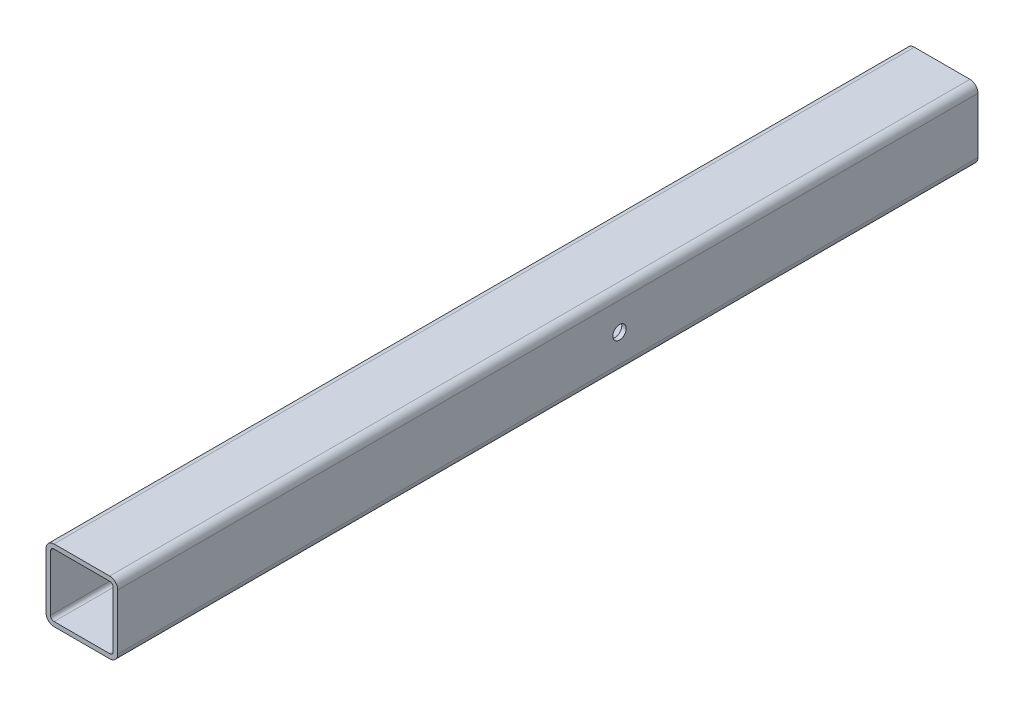
ISO-10303-21;
HEADER;
FILE_DESCRIPTION(('STEP AP214'),'2;1');
FILE_NAME('part.step','',(''),(''),'','','');
FILE_SCHEMA(('AUTOMOTIVE_DESIGN { 1 0 10303 214 1 1 1 1 }'));
ENDSEC;
DATA;
#1=APPLICATION_CONTEXT('core data for automotive mechanical design processes');
#2=APPLICATION_PROTOCOL_DEFINITION('international standard','automotive_design',2000,#1);
#3=PRODUCT_CONTEXT('',#1,'mechanical');
#4=PRODUCT('Part','Part','',(#3));
#5=PRODUCT_RELATED_PRODUCT_CATEGORY('part','',(#4));
#6=PRODUCT_DEFINITION_FORMATION('','',#4);
#7=PRODUCT_DEFINITION_CONTEXT('part definition',#1,'design');
#8=PRODUCT_DEFINITION('design','',#6,#7);
#9=PRODUCT_DEFINITION_SHAPE('','',#8);
#10=(LENGTH_UNIT() NAMED_UNIT(*) SI_UNIT(.MILLI.,.METRE.));
#11=(NAMED_UNIT(*) PLANE_ANGLE_UNIT() SI_UNIT($,.RADIAN.));
#12=(NAMED_UNIT(*) SI_UNIT($,.STERADIAN.) SOLID_ANGLE_UNIT());
#13=UNCERTAINTY_MEASURE_WITH_UNIT(LENGTH_MEASURE(1.E-05),#10,'distance_accuracy_value','');
#14=(GEOMETRIC_REPRESENTATION_CONTEXT(3) GLOBAL_UNCERTAINTY_ASSIGNED_CONTEXT((#13)) GLOBAL_UNIT_ASSIGNED_CONTEXT((#10,
#11,#12)) REPRESENTATION_CONTEXT('',''));
#15=CARTESIAN_POINT('',(0.,0.,0.));
#16=DIRECTION('',(0.,0.,1.));
#17=DIRECTION('',(1.,0.,0.));
#18=AXIS2_PLACEMENT_3D('',#15,#16,#17);
#19=CARTESIAN_POINT('',(-19.6849999999999,19.6849999999998,304.8));
#20=DIRECTION('',(0.,0.,-1.));
#21=DIRECTION('',(-1.,0.,0.));
#22=AXIS2_PLACEMENT_3D('',#19,#20,#21);
#23=PLANE('',#22);
#24=CARTESIAN_POINT('',(-19.6849999999999,19.6849999999998,304.8));
#25=DIRECTION('',(0.,0.,1.));
#26=DIRECTION('',(-1.,0.,0.));
#27=AXIS2_PLACEMENT_3D('',#24,#25,#26);
#28=CIRCLE('',#27,5.715);
#29=CARTESIAN_POINT('',(-19.685,25.3999999999998,304.8));
#30=VERTEX_POINT('',#29);
#31=CARTESIAN_POINT('',(-25.3999999999999,19.6850000000001,304.8));
#32=VERTEX_POINT('',#31);
#33=EDGE_CURVE('E215',#30,#32,#28,.T.);
#34=ORIENTED_EDGE('',*,*,#33,.T.);
#35=DIRECTION('',(0.,-1.,0.));
#36=VECTOR('',#35,1.);
#37=CARTESIAN_POINT('',(-25.3999999999999,-19.6850000000001,304.8));
#38=LINE('',#37,#36);
#39=CARTESIAN_POINT('',(-25.3999999999999,-19.6850000000001,304.8));
#40=VERTEX_POINT('',#39);
#41=EDGE_CURVE('E218',#32,#40,#38,.T.);
#42=ORIENTED_EDGE('',*,*,#41,.T.);
#43=CARTESIAN_POINT('',(-19.6849999999999,-19.6850000000002,304.8));
#44=DIRECTION('',(0.,0.,1.));
#45=DIRECTION('',(-1.,0.,0.));
#46=AXIS2_PLACEMENT_3D('',#43,#44,#45);
#47=CIRCLE('',#46,5.715);
#48=CARTESIAN_POINT('',(-19.685,-25.4000000000002,304.8));
#49=VERTEX_POINT('',#48);
#50=EDGE_CURVE('E221',#40,#49,#47,.T.);
#51=ORIENTED_EDGE('',*,*,#50,.T.);
#52=DIRECTION('',(1.,0.,0.));
#53=VECTOR('',#52,1.);
#54=CARTESIAN_POINT('',(-19.685,-25.4000000000002,304.8));
#55=LINE('',#54,#53);
#56=CARTESIAN_POINT('',(19.685,-25.4,304.8));
#57=VERTEX_POINT('',#56);
#58=EDGE_CURVE('E223',#49,#57,#55,.T.);
#59=ORIENTED_EDGE('',*,*,#58,.T.);
#60=CARTESIAN_POINT('',(19.6850000000001,-19.6850000000001,304.8));
#61=DIRECTION('',(0.,0.,1.));
#62=DIRECTION('',(1.,0.,0.));
#63=AXIS2_PLACEMENT_3D('',#60,#61,#62);
#64=CIRCLE('',#63,5.715);
#65=CARTESIAN_POINT('',(25.4000000000001,-19.685,304.8));
#66=VERTEX_POINT('',#65);
#67=EDGE_CURVE('E225',#57,#66,#64,.T.);
#68=ORIENTED_EDGE('',*,*,#67,.T.);
#69=DIRECTION('',(0.,1.,0.));
#70=VECTOR('',#69,1.);
#71=CARTESIAN_POINT('',(25.4000000000001,-19.685,304.8));
#72=LINE('',#71,#70);
#73=CARTESIAN_POINT('',(25.4000000000001,19.6850000000001,304.8));
#74=VERTEX_POINT('',#73);
#75=EDGE_CURVE('E227',#66,#74,#72,.T.);
#76=ORIENTED_EDGE('',*,*,#75,.T.);
#77=CARTESIAN_POINT('',(19.6850000000001,19.685,304.8));
#78=DIRECTION('',(0.,0.,1.));
#79=DIRECTION('',(-1.,0.,0.));
#80=AXIS2_PLACEMENT_3D('',#77,#78,#79);
#81=CIRCLE('',#80,5.715);
#82=CARTESIAN_POINT('',(19.685,25.4,304.8));
#83=VERTEX_POINT('',#82);
#84=EDGE_CURVE('E229',#74,#83,#81,.T.);
#85=ORIENTED_EDGE('',*,*,#84,.T.);
#86=DIRECTION('',(-1.,0.,0.));
#87=VECTOR('',#86,1.);
#88=CARTESIAN_POINT('',(-19.685,25.3999999999998,304.8));
#89=LINE('',#88,#87);
#90=EDGE_CURVE('E231',#83,#30,#89,.T.);
#91=ORIENTED_EDGE('',*,*,#90,.T.);
#92=EDGE_LOOP('',(#34,#42,#51,#59,#68,#76,#85,#91));
#93=FACE_BOUND('',#92,.T.);
#94=CARTESIAN_POINT('',(-19.6849999999999,-19.6850000000002,304.8));
#95=DIRECTION('',(0.,0.,1.));
#96=DIRECTION('',(-1.,0.,0.));
#97=AXIS2_PLACEMENT_3D('',#94,#95,#96);
#98=CIRCLE('',#97,2.54);
#99=CARTESIAN_POINT('',(-22.2249999999999,-19.685,304.8));
#100=VERTEX_POINT('',#99);
#101=CARTESIAN_POINT('',(-19.685,-22.2250000000002,304.8));
#102=VERTEX_POINT('',#101);
#103=EDGE_CURVE('E148',#100,#102,#98,.T.);
#104=ORIENTED_EDGE('',*,*,#103,.F.);
#105=DIRECTION('',(0.,-1.,0.));
#106=VECTOR('',#105,1.);
#107=CARTESIAN_POINT('',(-22.2249999999999,-19.685,304.8));
#108=LINE('',#107,#106);
#109=CARTESIAN_POINT('',(-22.2249999999999,19.6850000000001,304.8));
#110=VERTEX_POINT('',#109);
#111=EDGE_CURVE('E182',#110,#100,#108,.T.);
#112=ORIENTED_EDGE('',*,*,#111,.F.);
#113=CARTESIAN_POINT('',(-19.6849999999999,19.6849999999998,304.8));
#114=DIRECTION('',(0.,0.,1.));
#115=DIRECTION('',(-1.,0.,0.));
#116=AXIS2_PLACEMENT_3D('',#113,#114,#115);
#117=CIRCLE('',#116,2.54);
#118=CARTESIAN_POINT('',(-19.685,22.2249999999998,304.8));
#119=VERTEX_POINT('',#118);
#120=EDGE_CURVE('E180',#119,#110,#117,.T.);
#121=ORIENTED_EDGE('',*,*,#120,.F.);
#122=DIRECTION('',(-1.,0.,0.));
#123=VECTOR('',#122,1.);
#124=CARTESIAN_POINT('',(-19.685,22.2249999999998,304.8));
#125=LINE('',#124,#123);
#126=CARTESIAN_POINT('',(19.685,22.2249999999999,304.8));
#127=VERTEX_POINT('',#126);
#128=EDGE_CURVE('E178',#127,#119,#125,.T.);
#129=ORIENTED_EDGE('',*,*,#128,.F.);
#130=CARTESIAN_POINT('',(19.6850000000001,19.685,304.8));
#131=DIRECTION('',(0.,0.,1.));
#132=DIRECTION('',(-1.,0.,0.));
#133=AXIS2_PLACEMENT_3D('',#130,#131,#132);
#134=CIRCLE('',#133,2.54);
#135=CARTESIAN_POINT('',(22.2250000000001,19.685,304.8));
#136=VERTEX_POINT('',#135);
#137=EDGE_CURVE('E176',#136,#127,#134,.T.);
#138=ORIENTED_EDGE('',*,*,#137,.F.);
#139=DIRECTION('',(0.,1.,0.));
#140=VECTOR('',#139,1.);
#141=CARTESIAN_POINT('',(22.2250000000001,-19.685,304.8));
#142=LINE('',#141,#140);
#143=CARTESIAN_POINT('',(22.2250000000001,-19.685,304.8));
#144=VERTEX_POINT('',#143);
#145=EDGE_CURVE('E171',#144,#136,#142,.T.);
#146=ORIENTED_EDGE('',*,*,#145,.F.);
#147=CARTESIAN_POINT('',(19.6850000000001,-19.6850000000001,304.8));
#148=DIRECTION('',(0.,0.,1.));
#149=DIRECTION('',(1.,0.,0.));
#150=AXIS2_PLACEMENT_3D('',#147,#148,#149);
#151=CIRCLE('',#150,2.54);
#152=CARTESIAN_POINT('',(19.685,-22.2250000000001,304.8));
#153=VERTEX_POINT('',#152);
#154=EDGE_CURVE('E169',#153,#144,#151,.T.);
#155=ORIENTED_EDGE('',*,*,#154,.F.);
#156=DIRECTION('',(1.,0.,0.));
#157=VECTOR('',#156,1.);
#158=CARTESIAN_POINT('',(-19.685,-22.2250000000002,304.8));
#159=LINE('',#158,#157);
#160=EDGE_CURVE('E156',#102,#153,#159,.T.);
#161=ORIENTED_EDGE('',*,*,#160,.F.);
#162=EDGE_LOOP('',(#104,#112,#121,#129,#138,#146,#155,#161));
#163=FACE_BOUND('',#162,.T.);
#164=ADVANCED_FACE('F34',(#93,#163),#23,.F.);
#165=CARTESIAN_POINT('',(-19.685,19.685,-304.8));
#166=DIRECTION('',(0.,0.,-1.));
#167=DIRECTION('',(-1.,0.,0.));
#168=AXIS2_PLACEMENT_3D('',#165,#166,#167);
#169=PLANE('',#168);
#170=CARTESIAN_POINT('',(-19.685,19.685,-304.8));
#171=DIRECTION('',(0.,0.,1.));
#172=DIRECTION('',(-1.,0.,0.));
#173=AXIS2_PLACEMENT_3D('',#170,#171,#172);
#174=CIRCLE('',#173,5.715);
#175=CARTESIAN_POINT('',(-19.685,25.4,-304.8));
#176=VERTEX_POINT('',#175);
#177=CARTESIAN_POINT('',(-25.4,19.6849999999998,-304.8));
#178=VERTEX_POINT('',#177);
#179=EDGE_CURVE('E164',#176,#178,#174,.T.);
#180=ORIENTED_EDGE('',*,*,#179,.F.);
#181=DIRECTION('',(-1.,0.,0.));
#182=VECTOR('',#181,1.);
#183=CARTESIAN_POINT('',(-19.685,25.4,-304.8));
#184=LINE('',#183,#182);
#185=CARTESIAN_POINT('',(19.685,25.3999999999999,-304.8));
#186=VERTEX_POINT('',#185);
#187=EDGE_CURVE('E219',#186,#176,#184,.T.);
#188=ORIENTED_EDGE('',*,*,#187,.F.);
#189=CARTESIAN_POINT('',(19.685,19.6849999999998,-304.8));
#190=DIRECTION('',(0.,0.,1.));
#191=DIRECTION('',(-1.,0.,0.));
#192=AXIS2_PLACEMENT_3D('',#189,#190,#191);
#193=CIRCLE('',#192,5.715);
#194=CARTESIAN_POINT('',(25.4,19.6849999999998,-304.8));
#195=VERTEX_POINT('',#194);
#196=EDGE_CURVE('E246',#195,#186,#193,.T.);
#197=ORIENTED_EDGE('',*,*,#196,.F.);
#198=DIRECTION('',(0.,1.,0.));
#199=VECTOR('',#198,1.);
#200=CARTESIAN_POINT('',(25.4,-19.6850000000001,-304.8));
#201=LINE('',#200,#199);
#202=CARTESIAN_POINT('',(25.4,-19.6850000000001,-304.8));
#203=VERTEX_POINT('',#202);
#204=EDGE_CURVE('E244',#203,#195,#201,.T.);
#205=ORIENTED_EDGE('',*,*,#204,.F.);
#206=CARTESIAN_POINT('',(19.685,-19.6850000000002,-304.8));
#207=DIRECTION('',(0.,0.,1.));
#208=DIRECTION('',(1.,0.,0.));
#209=AXIS2_PLACEMENT_3D('',#206,#207,#208);
#210=CIRCLE('',#209,5.715);
#211=CARTESIAN_POINT('',(19.685,-25.4000000000002,-304.800000000001));
#212=VERTEX_POINT('',#211);
#213=EDGE_CURVE('E242',#212,#203,#210,.T.);
#214=ORIENTED_EDGE('',*,*,#213,.F.);
#215=DIRECTION('',(1.,0.,0.));
#216=VECTOR('',#215,1.);
#217=CARTESIAN_POINT('',(-19.685,-25.4,-304.800000000001));
#218=LINE('',#217,#216);
#219=CARTESIAN_POINT('',(-19.685,-25.4,-304.800000000001));
#220=VERTEX_POINT('',#219);
#221=EDGE_CURVE('E240',#220,#212,#218,.T.);
#222=ORIENTED_EDGE('',*,*,#221,.F.);
#223=CARTESIAN_POINT('',(-19.685,-19.6850000000001,-304.8));
#224=DIRECTION('',(0.,0.,1.));
#225=DIRECTION('',(-1.,0.,0.));
#226=AXIS2_PLACEMENT_3D('',#223,#224,#225);
#227=CIRCLE('',#226,5.715);
#228=CARTESIAN_POINT('',(-25.4,-19.6850000000002,-304.8));
#229=VERTEX_POINT('',#228);
#230=EDGE_CURVE('E238',#229,#220,#227,.T.);
#231=ORIENTED_EDGE('',*,*,#230,.F.);
#232=DIRECTION('',(0.,-1.,0.));
#233=VECTOR('',#232,1.);
#234=CARTESIAN_POINT('',(-25.4,-19.6850000000002,-304.8));
#235=LINE('',#234,#233);
#236=EDGE_CURVE('E236',#178,#229,#235,.T.);
#237=ORIENTED_EDGE('',*,*,#236,.F.);
#238=EDGE_LOOP('',(#180,#188,#197,#205,#214,#222,#231,#237));
#239=FACE_BOUND('',#238,.T.);
#240=DIRECTION('',(0.,-1.,0.));
#241=VECTOR('',#240,1.);
#242=CARTESIAN_POINT('',(-22.225,-19.6850000000002,-304.8));
#243=LINE('',#242,#241);
#244=CARTESIAN_POINT('',(-22.225,19.685,-304.8));
#245=VERTEX_POINT('',#244);
#246=CARTESIAN_POINT('',(-22.225,-19.6850000000002,-304.8));
#247=VERTEX_POINT('',#246);
#248=EDGE_CURVE('E157',#245,#247,#243,.T.);
#249=ORIENTED_EDGE('',*,*,#248,.T.);
#250=CARTESIAN_POINT('',(-19.685,-19.6850000000001,-304.8));
#251=DIRECTION('',(0.,0.,1.));
#252=DIRECTION('',(-1.,0.,0.));
#253=AXIS2_PLACEMENT_3D('',#250,#251,#252);
#254=CIRCLE('',#253,2.54);
#255=CARTESIAN_POINT('',(-19.685,-22.2250000000001,-304.8));
#256=VERTEX_POINT('',#255);
#257=EDGE_CURVE('E58',#247,#256,#254,.T.);
#258=ORIENTED_EDGE('',*,*,#257,.T.);
#259=DIRECTION('',(1.,0.,0.));
#260=VECTOR('',#259,1.);
#261=CARTESIAN_POINT('',(-19.685,-22.2250000000001,-304.8));
#262=LINE('',#261,#260);
#263=CARTESIAN_POINT('',(19.685,-22.2250000000002,-304.8));
#264=VERTEX_POINT('',#263);
#265=EDGE_CURVE('E163',#256,#264,#262,.T.);
#266=ORIENTED_EDGE('',*,*,#265,.T.);
#267=CARTESIAN_POINT('',(19.685,-19.6850000000002,-304.8));
#268=DIRECTION('',(0.,0.,1.));
#269=DIRECTION('',(1.,0.,0.));
#270=AXIS2_PLACEMENT_3D('',#267,#268,#269);
#271=CIRCLE('',#270,2.54);
#272=CARTESIAN_POINT('',(22.225,-19.6850000000002,-304.8));
#273=VERTEX_POINT('',#272);
#274=EDGE_CURVE('E187',#264,#273,#271,.T.);
#275=ORIENTED_EDGE('',*,*,#274,.T.);
#276=DIRECTION('',(0.,1.,0.));
#277=VECTOR('',#276,1.);
#278=CARTESIAN_POINT('',(22.225,-19.6850000000002,-304.8));
#279=LINE('',#278,#277);
#280=CARTESIAN_POINT('',(22.225,19.6849999999998,-304.8));
#281=VERTEX_POINT('',#280);
#282=EDGE_CURVE('E190',#273,#281,#279,.T.);
#283=ORIENTED_EDGE('',*,*,#282,.T.);
#284=CARTESIAN_POINT('',(19.685,19.6849999999998,-304.8));
#285=DIRECTION('',(0.,0.,1.));
#286=DIRECTION('',(-1.,0.,0.));
#287=AXIS2_PLACEMENT_3D('',#284,#285,#286);
#288=CIRCLE('',#287,2.54);
#289=CARTESIAN_POINT('',(19.685,22.2249999999998,-304.8));
#290=VERTEX_POINT('',#289);
#291=EDGE_CURVE('E193',#281,#290,#288,.T.);
#292=ORIENTED_EDGE('',*,*,#291,.T.);
#293=DIRECTION('',(-1.,0.,0.));
#294=VECTOR('',#293,1.);
#295=CARTESIAN_POINT('',(-19.685,22.2249999999999,-304.8));
#296=LINE('',#295,#294);
#297=CARTESIAN_POINT('',(-19.685,22.2249999999999,-304.8));
#298=VERTEX_POINT('',#297);
#299=EDGE_CURVE('E196',#290,#298,#296,.T.);
#300=ORIENTED_EDGE('',*,*,#299,.T.);
#301=CARTESIAN_POINT('',(-19.685,19.685,-304.8));
#302=DIRECTION('',(0.,0.,1.));
#303=DIRECTION('',(-1.,0.,0.));
#304=AXIS2_PLACEMENT_3D('',#301,#302,#303);
#305=CIRCLE('',#304,2.54);
#306=EDGE_CURVE('E199',#298,#245,#305,.T.);
#307=ORIENTED_EDGE('',*,*,#306,.T.);
#308=EDGE_LOOP('',(#249,#258,#266,#275,#283,#292,#300,#307));
#309=FACE_BOUND('',#308,.T.);
#310=ADVANCED_FACE('F277',(#239,#309),#169,.T.);
#311=CARTESIAN_POINT('',(-19.6849999999999,19.6849999999998,304.8));
#312=DIRECTION('',(0.,0.,-1.));
#313=DIRECTION('',(-1.,0.,0.));
#314=AXIS2_PLACEMENT_3D('',#311,#312,#313);
#315=CYLINDRICAL_SURFACE('',#314,5.715);
#316=ORIENTED_EDGE('',*,*,#179,.T.);
#317=DIRECTION('',(0.,0.,-1.));
#318=VECTOR('',#317,1.);
#319=CARTESIAN_POINT('',(-25.3999999999999,19.6850000000001,304.8));
#320=LINE('',#319,#318);
#321=EDGE_CURVE('E11',#32,#178,#320,.T.);
#322=ORIENTED_EDGE('',*,*,#321,.F.);
#323=ORIENTED_EDGE('',*,*,#33,.F.);
#324=DIRECTION('',(0.,0.,-1.));
#325=VECTOR('',#324,1.);
#326=CARTESIAN_POINT('',(-19.685,25.3999999999998,304.8));
#327=LINE('',#326,#325);
#328=EDGE_CURVE('E233',#30,#176,#327,.T.);
#329=ORIENTED_EDGE('',*,*,#328,.T.);
#330=EDGE_LOOP('',(#316,#322,#323,#329));
#331=FACE_BOUND('',#330,.T.);
#332=ADVANCED_FACE('F36',(#331),#315,.T.);
#333=CARTESIAN_POINT('',(-25.3999999999999,-19.6850000000001,304.8));
#334=DIRECTION('',(1.,0.,0.));
#335=DIRECTION('',(0.,1.,0.));
#336=AXIS2_PLACEMENT_3D('',#333,#334,#335);
#337=PLANE('',#336);
#338=CARTESIAN_POINT('',(-25.3999999999999,-2.22044604925031E-13,-50.8));
#339=DIRECTION('',(1.,0.,0.));
#340=DIRECTION('',(0.,1.,0.));
#341=AXIS2_PLACEMENT_3D('',#338,#339,#340);
#342=CIRCLE('',#341,4.7625);
#343=CARTESIAN_POINT('',(-25.4,4.76250000000001,-50.8));
#344=VERTEX_POINT('',#343);
#345=EDGE_CURVE('E185',#344,#344,#342,.T.);
#346=ORIENTED_EDGE('',*,*,#345,.T.);
#347=EDGE_LOOP('',(#346));
#348=FACE_BOUND('',#347,.T.);
#349=ORIENTED_EDGE('',*,*,#236,.T.);
#350=DIRECTION('',(0.,0.,-1.));
#351=VECTOR('',#350,1.);
#352=CARTESIAN_POINT('',(-25.3999999999999,-19.6850000000001,304.8));
#353=LINE('',#352,#351);
#354=EDGE_CURVE('E43',#40,#229,#353,.T.);
#355=ORIENTED_EDGE('',*,*,#354,.F.);
#356=ORIENTED_EDGE('',*,*,#41,.F.);
#357=ORIENTED_EDGE('',*,*,#321,.T.);
#358=EDGE_LOOP('',(#349,#355,#356,#357));
#359=FACE_BOUND('',#358,.T.);
#360=ADVANCED_FACE('F294',(#348,#359),#337,.F.);
#361=CARTESIAN_POINT('',(-19.6849999999999,-19.6850000000002,304.8));
#362=DIRECTION('',(0.,0.,-1.));
#363=DIRECTION('',(-1.,0.,0.));
#364=AXIS2_PLACEMENT_3D('',#361,#362,#363);
#365=CYLINDRICAL_SURFACE('',#364,5.715);
#366=ORIENTED_EDGE('',*,*,#230,.T.);
#367=DIRECTION('',(0.,0.,-1.));
#368=VECTOR('',#367,1.);
#369=CARTESIAN_POINT('',(-19.685,-25.4000000000002,304.8));
#370=LINE('',#369,#368);
#371=EDGE_CURVE('E263',#49,#220,#370,.T.);
#372=ORIENTED_EDGE('',*,*,#371,.F.);
#373=ORIENTED_EDGE('',*,*,#50,.F.);
#374=ORIENTED_EDGE('',*,*,#354,.T.);
#375=EDGE_LOOP('',(#366,#372,#373,#374));
#376=FACE_BOUND('',#375,.T.);
#377=ADVANCED_FACE('F271',(#376),#365,.T.);
#378=CARTESIAN_POINT('',(-19.685,-25.4000000000002,304.8));
#379=DIRECTION('',(0.,1.,0.));
#380=DIRECTION('',(-1.,0.,0.));
#381=AXIS2_PLACEMENT_3D('',#378,#379,#380);
#382=PLANE('',#381);
#383=ORIENTED_EDGE('',*,*,#221,.T.);
#384=DIRECTION('',(0.,0.,-1.));
#385=VECTOR('',#384,1.);
#386=CARTESIAN_POINT('',(19.685,-25.4,304.8));
#387=LINE('',#386,#385);
#388=EDGE_CURVE('E260',#57,#212,#387,.T.);
#389=ORIENTED_EDGE('',*,*,#388,.F.);
#390=ORIENTED_EDGE('',*,*,#58,.F.);
#391=ORIENTED_EDGE('',*,*,#371,.T.);
#392=EDGE_LOOP('',(#383,#389,#390,#391));
#393=FACE_BOUND('',#392,.T.);
#394=ADVANCED_FACE('F283',(#393),#382,.F.);
#395=CARTESIAN_POINT('',(19.6850000000001,-19.6850000000001,304.8));
#396=DIRECTION('',(0.,0.,-1.));
#397=DIRECTION('',(-1.,0.,0.));
#398=AXIS2_PLACEMENT_3D('',#395,#396,#397);
#399=CYLINDRICAL_SURFACE('',#398,5.715);
#400=ORIENTED_EDGE('',*,*,#213,.T.);
#401=DIRECTION('',(0.,0.,-1.));
#402=VECTOR('',#401,1.);
#403=CARTESIAN_POINT('',(25.4000000000001,-19.685,304.8));
#404=LINE('',#403,#402);
#405=EDGE_CURVE('E257',#66,#203,#404,.T.);
#406=ORIENTED_EDGE('',*,*,#405,.F.);
#407=ORIENTED_EDGE('',*,*,#67,.F.);
#408=ORIENTED_EDGE('',*,*,#388,.T.);
#409=EDGE_LOOP('',(#400,#406,#407,#408));
#410=FACE_BOUND('',#409,.T.);
#411=ADVANCED_FACE('F287',(#410),#399,.T.);
#412=CARTESIAN_POINT('',(25.4000000000001,-19.685,304.8));
#413=DIRECTION('',(-1.,0.,0.));
#414=DIRECTION('',(0.,-1.,0.));
#415=AXIS2_PLACEMENT_3D('',#412,#413,#414);
#416=PLANE('',#415);
#417=CARTESIAN_POINT('',(25.4,0.,-50.8));
#418=DIRECTION('',(1.,0.,0.));
#419=DIRECTION('',(0.,1.,0.));
#420=AXIS2_PLACEMENT_3D('',#417,#418,#419);
#421=CIRCLE('',#420,4.7625);
#422=CARTESIAN_POINT('',(25.4,4.76250000000001,-50.8));
#423=VERTEX_POINT('',#422);
#424=EDGE_CURVE('E379',#423,#423,#421,.T.);
#425=ORIENTED_EDGE('',*,*,#424,.F.);
#426=EDGE_LOOP('',(#425));
#427=FACE_BOUND('',#426,.T.);
#428=ORIENTED_EDGE('',*,*,#204,.T.);
#429=DIRECTION('',(0.,0.,-1.));
#430=VECTOR('',#429,1.);
#431=CARTESIAN_POINT('',(25.4000000000001,19.6850000000001,304.8));
#432=LINE('',#431,#430);
#433=EDGE_CURVE('E254',#74,#195,#432,.T.);
#434=ORIENTED_EDGE('',*,*,#433,.F.);
#435=ORIENTED_EDGE('',*,*,#75,.F.);
#436=ORIENTED_EDGE('',*,*,#405,.T.);
#437=EDGE_LOOP('',(#428,#434,#435,#436));
#438=FACE_BOUND('',#437,.T.);
#439=ADVANCED_FACE('F307',(#427,#438),#416,.F.);
#440=CARTESIAN_POINT('',(19.6850000000001,19.685,304.8));
#441=DIRECTION('',(0.,0.,-1.));
#442=DIRECTION('',(-1.,0.,0.));
#443=AXIS2_PLACEMENT_3D('',#440,#441,#442);
#444=CYLINDRICAL_SURFACE('',#443,5.715);
#445=ORIENTED_EDGE('',*,*,#196,.T.);
#446=DIRECTION('',(0.,0.,-1.));
#447=VECTOR('',#446,1.);
#448=CARTESIAN_POINT('',(19.685,25.4,304.8));
#449=LINE('',#448,#447);
#450=EDGE_CURVE('E251',#83,#186,#449,.T.);
#451=ORIENTED_EDGE('',*,*,#450,.F.);
#452=ORIENTED_EDGE('',*,*,#84,.F.);
#453=ORIENTED_EDGE('',*,*,#433,.T.);
#454=EDGE_LOOP('',(#445,#451,#452,#453));
#455=FACE_BOUND('',#454,.T.);
#456=ADVANCED_FACE('F305',(#455),#444,.T.);
#457=CARTESIAN_POINT('',(-19.685,25.3999999999998,304.8));
#458=DIRECTION('',(0.,-1.,0.));
#459=DIRECTION('',(0.,0.,-1.));
#460=AXIS2_PLACEMENT_3D('',#457,#458,#459);
#461=PLANE('',#460);
#462=ORIENTED_EDGE('',*,*,#187,.T.);
#463=ORIENTED_EDGE('',*,*,#328,.F.);
#464=ORIENTED_EDGE('',*,*,#90,.F.);
#465=ORIENTED_EDGE('',*,*,#450,.T.);
#466=EDGE_LOOP('',(#462,#463,#464,#465));
#467=FACE_BOUND('',#466,.T.);
#468=ADVANCED_FACE('F300',(#467),#461,.F.);
#469=CARTESIAN_POINT('',(-19.6849999999999,-19.6850000000002,304.8));
#470=DIRECTION('',(0.,0.,-1.));
#471=DIRECTION('',(-1.,0.,0.));
#472=AXIS2_PLACEMENT_3D('',#469,#470,#471);
#473=CYLINDRICAL_SURFACE('',#472,2.54);
#474=ORIENTED_EDGE('',*,*,#257,.F.);
#475=DIRECTION('',(0.,0.,-1.));
#476=VECTOR('',#475,1.);
#477=CARTESIAN_POINT('',(-22.2249999999999,-19.685,304.8));
#478=LINE('',#477,#476);
#479=EDGE_CURVE('E152',#100,#247,#478,.T.);
#480=ORIENTED_EDGE('',*,*,#479,.F.);
#481=ORIENTED_EDGE('',*,*,#103,.T.);
#482=DIRECTION('',(0.,0.,-1.));
#483=VECTOR('',#482,1.);
#484=CARTESIAN_POINT('',(-19.685,-22.2250000000002,304.8));
#485=LINE('',#484,#483);
#486=EDGE_CURVE('E151',#102,#256,#485,.T.);
#487=ORIENTED_EDGE('',*,*,#486,.T.);
#488=EDGE_LOOP('',(#474,#480,#481,#487));
#489=FACE_BOUND('',#488,.T.);
#490=ADVANCED_FACE('F150',(#489),#473,.F.);
#491=CARTESIAN_POINT('',(-19.685,-22.2250000000002,304.8));
#492=DIRECTION('',(0.,1.,0.));
#493=DIRECTION('',(0.,0.,1.));
#494=AXIS2_PLACEMENT_3D('',#491,#492,#493);
#495=PLANE('',#494);
#496=ORIENTED_EDGE('',*,*,#265,.F.);
#497=ORIENTED_EDGE('',*,*,#486,.F.);
#498=ORIENTED_EDGE('',*,*,#160,.T.);
#499=DIRECTION('',(0.,0.,-1.));
#500=VECTOR('',#499,1.);
#501=CARTESIAN_POINT('',(19.685,-22.2250000000001,304.8));
#502=LINE('',#501,#500);
#503=EDGE_CURVE('E165',#153,#264,#502,.T.);
#504=ORIENTED_EDGE('',*,*,#503,.T.);
#505=EDGE_LOOP('',(#496,#497,#498,#504));
#506=FACE_BOUND('',#505,.T.);
#507=ADVANCED_FACE('F160',(#506),#495,.T.);
#508=CARTESIAN_POINT('',(19.6850000000001,-19.6850000000001,304.8));
#509=DIRECTION('',(0.,0.,-1.));
#510=DIRECTION('',(-1.,0.,0.));
#511=AXIS2_PLACEMENT_3D('',#508,#509,#510);
#512=CYLINDRICAL_SURFACE('',#511,2.54);
#513=ORIENTED_EDGE('',*,*,#274,.F.);
#514=ORIENTED_EDGE('',*,*,#503,.F.);
#515=ORIENTED_EDGE('',*,*,#154,.T.);
#516=DIRECTION('',(0.,0.,-1.));
#517=VECTOR('',#516,1.);
#518=CARTESIAN_POINT('',(22.2250000000001,-19.685,304.8));
#519=LINE('',#518,#517);
#520=EDGE_CURVE('E212',#144,#273,#519,.T.);
#521=ORIENTED_EDGE('',*,*,#520,.T.);
#522=EDGE_LOOP('',(#513,#514,#515,#521));
#523=FACE_BOUND('',#522,.T.);
#524=ADVANCED_FACE('F334',(#523),#512,.F.);
#525=CARTESIAN_POINT('',(22.2250000000001,-19.685,304.8));
#526=DIRECTION('',(-1.,0.,0.));
#527=DIRECTION('',(0.,0.,1.));
#528=AXIS2_PLACEMENT_3D('',#525,#526,#527);
#529=PLANE('',#528);
#530=CARTESIAN_POINT('',(22.225,-2.22044604925031E-13,-50.8));
#531=DIRECTION('',(-1.,0.,0.));
#532=DIRECTION('',(0.,0.,1.));
#533=AXIS2_PLACEMENT_3D('',#530,#531,#532);
#534=CIRCLE('',#533,4.7625);
#535=CARTESIAN_POINT('',(22.225,4.76250000000001,-50.8));
#536=VERTEX_POINT('',#535);
#537=EDGE_CURVE('E375',#536,#536,#534,.T.);
#538=ORIENTED_EDGE('',*,*,#537,.F.);
#539=EDGE_LOOP('',(#538));
#540=FACE_BOUND('',#539,.T.);
#541=ORIENTED_EDGE('',*,*,#282,.F.);
#542=ORIENTED_EDGE('',*,*,#520,.F.);
#543=ORIENTED_EDGE('',*,*,#145,.T.);
#544=DIRECTION('',(0.,0.,-1.));
#545=VECTOR('',#544,1.);
#546=CARTESIAN_POINT('',(22.2250000000001,19.685,304.8));
#547=LINE('',#546,#545);
#548=EDGE_CURVE('E210',#136,#281,#547,.T.);
#549=ORIENTED_EDGE('',*,*,#548,.T.);
#550=EDGE_LOOP('',(#541,#542,#543,#549));
#551=FACE_BOUND('',#550,.T.);
#552=ADVANCED_FACE('F338',(#540,#551),#529,.T.);
#553=CARTESIAN_POINT('',(19.6850000000001,19.685,304.8));
#554=DIRECTION('',(0.,0.,-1.));
#555=DIRECTION('',(-1.,0.,0.));
#556=AXIS2_PLACEMENT_3D('',#553,#554,#555);
#557=CYLINDRICAL_SURFACE('',#556,2.54);
#558=ORIENTED_EDGE('',*,*,#291,.F.);
#559=ORIENTED_EDGE('',*,*,#548,.F.);
#560=ORIENTED_EDGE('',*,*,#137,.T.);
#561=DIRECTION('',(0.,0.,-1.));
#562=VECTOR('',#561,1.);
#563=CARTESIAN_POINT('',(19.685,22.2249999999999,304.8));
#564=LINE('',#563,#562);
#565=EDGE_CURVE('E208',#127,#290,#564,.T.);
#566=ORIENTED_EDGE('',*,*,#565,.T.);
#567=EDGE_LOOP('',(#558,#559,#560,#566));
#568=FACE_BOUND('',#567,.T.);
#569=ADVANCED_FACE('F344',(#568),#557,.F.);
#570=CARTESIAN_POINT('',(-19.685,22.2249999999998,304.8));
#571=DIRECTION('',(0.,-1.,0.));
#572=DIRECTION('',(0.,0.,-1.));
#573=AXIS2_PLACEMENT_3D('',#570,#571,#572);
#574=PLANE('',#573);
#575=ORIENTED_EDGE('',*,*,#299,.F.);
#576=ORIENTED_EDGE('',*,*,#565,.F.);
#577=ORIENTED_EDGE('',*,*,#128,.T.);
#578=DIRECTION('',(0.,0.,-1.));
#579=VECTOR('',#578,1.);
#580=CARTESIAN_POINT('',(-19.685,22.2249999999998,304.8));
#581=LINE('',#580,#579);
#582=EDGE_CURVE('E206',#119,#298,#581,.T.);
#583=ORIENTED_EDGE('',*,*,#582,.T.);
#584=EDGE_LOOP('',(#575,#576,#577,#583));
#585=FACE_BOUND('',#584,.T.);
#586=ADVANCED_FACE('F348',(#585),#574,.T.);
#587=CARTESIAN_POINT('',(-19.6849999999999,19.6849999999998,304.8));
#588=DIRECTION('',(0.,0.,-1.));
#589=DIRECTION('',(-1.,0.,0.));
#590=AXIS2_PLACEMENT_3D('',#587,#588,#589);
#591=CYLINDRICAL_SURFACE('',#590,2.54);
#592=ORIENTED_EDGE('',*,*,#306,.F.);
#593=ORIENTED_EDGE('',*,*,#582,.F.);
#594=ORIENTED_EDGE('',*,*,#120,.T.);
#595=DIRECTION('',(0.,0.,-1.));
#596=VECTOR('',#595,1.);
#597=CARTESIAN_POINT('',(-22.2249999999999,19.6850000000001,304.8));
#598=LINE('',#597,#596);
#599=EDGE_CURVE('E50',#110,#245,#598,.T.);
#600=ORIENTED_EDGE('',*,*,#599,.T.);
#601=EDGE_LOOP('',(#592,#593,#594,#600));
#602=FACE_BOUND('',#601,.T.);
#603=ADVANCED_FACE('F352',(#602),#591,.F.);
#604=CARTESIAN_POINT('',(-22.2249999999999,-19.685,304.8));
#605=DIRECTION('',(1.,0.,0.));
#606=DIRECTION('',(0.,0.,-1.));
#607=AXIS2_PLACEMENT_3D('',#604,#605,#606);
#608=PLANE('',#607);
#609=CARTESIAN_POINT('',(-22.2249999999999,0.,-50.8));
#610=DIRECTION('',(1.,0.,0.));
#611=DIRECTION('',(0.,0.,-1.));
#612=AXIS2_PLACEMENT_3D('',#609,#610,#611);
#613=CIRCLE('',#612,4.7625);
#614=CARTESIAN_POINT('',(-22.2249999999999,4.76250000000001,-50.8));
#615=VERTEX_POINT('',#614);
#616=EDGE_CURVE('E38',#615,#615,#613,.T.);
#617=ORIENTED_EDGE('',*,*,#616,.F.);
#618=EDGE_LOOP('',(#617));
#619=FACE_BOUND('',#618,.T.);
#620=ORIENTED_EDGE('',*,*,#248,.F.);
#621=ORIENTED_EDGE('',*,*,#599,.F.);
#622=ORIENTED_EDGE('',*,*,#111,.T.);
#623=ORIENTED_EDGE('',*,*,#479,.T.);
#624=EDGE_LOOP('',(#620,#621,#622,#623));
#625=FACE_BOUND('',#624,.T.);
#626=ADVANCED_FACE('F356',(#619,#625),#608,.T.);
#627=CARTESIAN_POINT('',(-50.7999999999999,0.,-50.8));
#628=DIRECTION('',(1.,0.,0.));
#629=DIRECTION('',(0.,1.,0.));
#630=AXIS2_PLACEMENT_3D('',#627,#628,#629);
#631=CYLINDRICAL_SURFACE('',#630,4.7625);
#632=CARTESIAN_POINT('',(-22.2249999999999,4.76250000000001,-50.8));
#633=CARTESIAN_POINT('',(-22.2580729166666,4.76250000000001,-50.8));
#634=CARTESIAN_POINT('',(-22.2911458333332,4.76250000000001,-50.8));
#635=CARTESIAN_POINT('',(-22.3572916666666,4.76250000000001,-50.8));
#636=CARTESIAN_POINT('',(-22.3903645833332,4.76250000000001,-50.8));
#637=CARTESIAN_POINT('',(-22.4565104166666,4.76250000000001,-50.8));
#638=CARTESIAN_POINT('',(-22.4895833333333,4.76250000000001,-50.8));
#639=CARTESIAN_POINT('',(-22.5557291666666,4.76250000000001,-50.8));
#640=CARTESIAN_POINT('',(-22.5888020833333,4.76250000000001,-50.8));
#641=CARTESIAN_POINT('',(-22.6549479166666,4.76250000000001,-50.8));
#642=CARTESIAN_POINT('',(-22.6880208333333,4.76250000000001,-50.8));
#643=CARTESIAN_POINT('',(-22.7541666666666,4.76250000000001,-50.8));
#644=CARTESIAN_POINT('',(-22.7872395833333,4.76250000000001,-50.8));
#645=CARTESIAN_POINT('',(-22.8533854166666,4.76250000000001,-50.8));
#646=CARTESIAN_POINT('',(-22.8864583333333,4.76250000000001,-50.8));
#647=CARTESIAN_POINT('',(-22.9526041666666,4.76250000000001,-50.8));
#648=CARTESIAN_POINT('',(-22.9856770833333,4.76250000000001,-50.8));
#649=CARTESIAN_POINT('',(-23.0518229166666,4.76250000000001,-50.8));
#650=CARTESIAN_POINT('',(-23.0848958333333,4.76250000000001,-50.8));
#651=CARTESIAN_POINT('',(-23.1510416666666,4.76250000000001,-50.8));
#652=CARTESIAN_POINT('',(-23.1841145833333,4.76250000000001,-50.8));
#653=CARTESIAN_POINT('',(-23.2502604166666,4.76250000000001,-50.8));
#654=CARTESIAN_POINT('',(-23.2833333333333,4.76250000000001,-50.8));
#655=CARTESIAN_POINT('',(-23.3494791666666,4.76250000000001,-50.8));
#656=CARTESIAN_POINT('',(-23.3825520833333,4.76250000000001,-50.8));
#657=CARTESIAN_POINT('',(-23.4486979166666,4.76250000000001,-50.8));
#658=CARTESIAN_POINT('',(-23.4817708333333,4.76250000000001,-50.8));
#659=CARTESIAN_POINT('',(-23.5479166666666,4.76250000000001,-50.8));
#660=CARTESIAN_POINT('',(-23.5809895833333,4.76250000000001,-50.8));
#661=CARTESIAN_POINT('',(-23.6471354166666,4.76250000000001,-50.8));
#662=CARTESIAN_POINT('',(-23.6802083333333,4.76250000000001,-50.8));
#663=CARTESIAN_POINT('',(-23.7463541666666,4.76250000000001,-50.8));
#664=CARTESIAN_POINT('',(-23.7794270833333,4.76250000000001,-50.8));
#665=CARTESIAN_POINT('',(-23.8455729166666,4.76250000000001,-50.8));
#666=CARTESIAN_POINT('',(-23.8786458333333,4.76250000000001,-50.8));
#667=CARTESIAN_POINT('',(-23.9447916666666,4.76250000000001,-50.8));
#668=CARTESIAN_POINT('',(-23.9778645833333,4.76250000000001,-50.8));
#669=CARTESIAN_POINT('',(-24.0440104166666,4.76250000000001,-50.8));
#670=CARTESIAN_POINT('',(-24.0770833333333,4.76250000000001,-50.8));
#671=CARTESIAN_POINT('',(-24.1432291666666,4.76250000000001,-50.8));
#672=CARTESIAN_POINT('',(-24.1763020833333,4.76250000000001,-50.8));
#673=CARTESIAN_POINT('',(-24.2424479166666,4.76250000000001,-50.8));
#674=CARTESIAN_POINT('',(-24.2755208333333,4.76250000000001,-50.8));
#675=CARTESIAN_POINT('',(-24.3416666666666,4.76250000000001,-50.8));
#676=CARTESIAN_POINT('',(-24.3747395833333,4.76250000000001,-50.8));
#677=CARTESIAN_POINT('',(-24.4408854166666,4.76250000000001,-50.8));
#678=CARTESIAN_POINT('',(-24.4739583333333,4.76250000000001,-50.8));
#679=CARTESIAN_POINT('',(-24.5401041666666,4.76250000000001,-50.8));
#680=CARTESIAN_POINT('',(-24.5731770833333,4.76250000000001,-50.8));
#681=CARTESIAN_POINT('',(-24.6393229166666,4.76250000000001,-50.8));
#682=CARTESIAN_POINT('',(-24.6723958333333,4.76250000000001,-50.8));
#683=CARTESIAN_POINT('',(-24.7385416666666,4.76250000000001,-50.8));
#684=CARTESIAN_POINT('',(-24.7716145833333,4.76250000000001,-50.8));
#685=CARTESIAN_POINT('',(-24.8377604166666,4.76250000000001,-50.8));
#686=CARTESIAN_POINT('',(-24.8708333333333,4.76250000000001,-50.8));
#687=CARTESIAN_POINT('',(-24.9369791666666,4.76250000000001,-50.8));
#688=CARTESIAN_POINT('',(-24.9700520833333,4.76250000000001,-50.8));
#689=CARTESIAN_POINT('',(-25.0361979166666,4.76250000000001,-50.8));
#690=CARTESIAN_POINT('',(-25.0692708333333,4.76250000000001,-50.8));
#691=CARTESIAN_POINT('',(-25.1354166666666,4.76250000000001,-50.8));
#692=CARTESIAN_POINT('',(-25.1684895833333,4.76250000000001,-50.8));
#693=CARTESIAN_POINT('',(-25.2346354166666,4.76250000000001,-50.8));
#694=CARTESIAN_POINT('',(-25.2677083333333,4.76250000000001,-50.8));
#695=CARTESIAN_POINT('',(-25.3338541666666,4.76250000000001,-50.8));
#696=CARTESIAN_POINT('',(-25.3669270833333,4.76250000000001,-50.8));
#697=CARTESIAN_POINT('',(-25.4,4.76250000000001,-50.8));
#698=B_SPLINE_CURVE_WITH_KNOTS('',3,(#632,#633,#634,#635,#636,#637,#638,#639,#640,#641,#642,
#643,#644,#645,#646,#647,#648,#649,#650,#651,#652,#653,#654,#655,#656,#657,#658,#659,#660,#661,
#662,#663,#664,#665,#666,#667,#668,#669,#670,#671,#672,#673,#674,#675,#676,#677,#678,#679,#680,
#681,#682,#683,#684,#685,#686,#687,#688,#689,#690,#691,#692,#693,#694,#695,#696,#697),
.UNSPECIFIED.,.F.,.F.,(4,2,2,2,2,2,2,2,2,2,2,2,2,2,2,2,2,2,2,2,2,2,2,2,2,2,2,2,2,2,2,2,4),(0.,
0.0992187500000012,0.198437500000002,0.297656250000004,0.396875000000005,0.496093750000006,
0.595312500000007,0.694531250000008,0.79375000000001,0.892968750000011,0.992187500000012,
1.09140625000001,1.19062500000001,1.28984375000002,1.38906250000002,1.48828125000002,
1.58750000000002,1.68671875000002,1.78593750000002,1.88515625000002,1.98437500000002,
2.08359375000003,2.18281250000003,2.28203125000003,2.38125000000003,2.48046875000003,
2.57968750000003,2.67890625000003,2.77812500000003,2.87734375000004,2.97656250000004,
3.07578125000004,3.17500000000004),.UNSPECIFIED.);
#699=EDGE_CURVE('BSEAM360',#615,#344,#698,.T.);
#700=ORIENTED_EDGE('',*,*,#616,.T.);
#701=ORIENTED_EDGE('',*,*,#345,.F.);
#702=ORIENTED_EDGE('',*,*,#699,.T.);
#703=ORIENTED_EDGE('',*,*,#699,.F.);
#704=EDGE_LOOP('',(#700,#702,#701,#703));
#705=FACE_BOUND('',#704,.T.);
#706=ADVANCED_FACE('F360',(#705),#631,.F.);
#707=CARTESIAN_POINT('',(22.225,4.76250000000001,-50.8));
#708=CARTESIAN_POINT('',(22.2580729166667,4.76250000000001,-50.8));
#709=CARTESIAN_POINT('',(22.2911458333333,4.76250000000001,-50.8));
#710=CARTESIAN_POINT('',(22.3572916666667,4.76250000000001,-50.8));
#711=CARTESIAN_POINT('',(22.3903645833333,4.76250000000001,-50.8));
#712=CARTESIAN_POINT('',(22.4565104166667,4.76250000000001,-50.8));
#713=CARTESIAN_POINT('',(22.4895833333333,4.76250000000001,-50.8));
#714=CARTESIAN_POINT('',(22.5557291666667,4.76250000000001,-50.8));
#715=CARTESIAN_POINT('',(22.5888020833333,4.76250000000001,-50.8));
#716=CARTESIAN_POINT('',(22.6549479166667,4.76250000000001,-50.8));
#717=CARTESIAN_POINT('',(22.6880208333333,4.76250000000001,-50.8));
#718=CARTESIAN_POINT('',(22.7541666666667,4.76250000000001,-50.8));
#719=CARTESIAN_POINT('',(22.7872395833333,4.76250000000001,-50.8));
#720=CARTESIAN_POINT('',(22.8533854166667,4.76250000000001,-50.8));
#721=CARTESIAN_POINT('',(22.8864583333333,4.76250000000001,-50.8));
#722=CARTESIAN_POINT('',(22.9526041666667,4.76250000000001,-50.8));
#723=CARTESIAN_POINT('',(22.9856770833333,4.76250000000001,-50.8));
#724=CARTESIAN_POINT('',(23.0518229166667,4.76250000000001,-50.8));
#725=CARTESIAN_POINT('',(23.0848958333333,4.76250000000001,-50.8));
#726=CARTESIAN_POINT('',(23.1510416666667,4.76250000000001,-50.8));
#727=CARTESIAN_POINT('',(23.1841145833333,4.76250000000001,-50.8));
#728=CARTESIAN_POINT('',(23.2502604166667,4.76250000000001,-50.8));
#729=CARTESIAN_POINT('',(23.2833333333333,4.76250000000001,-50.8));
#730=CARTESIAN_POINT('',(23.3494791666667,4.76250000000001,-50.8));
#731=CARTESIAN_POINT('',(23.3825520833333,4.76250000000001,-50.8));
#732=CARTESIAN_POINT('',(23.4486979166667,4.76250000000001,-50.8));
#733=CARTESIAN_POINT('',(23.4817708333333,4.76250000000001,-50.8));
#734=CARTESIAN_POINT('',(23.5479166666667,4.76250000000001,-50.8));
#735=CARTESIAN_POINT('',(23.5809895833333,4.76250000000001,-50.8));
#736=CARTESIAN_POINT('',(23.6471354166667,4.76250000000001,-50.8));
#737=CARTESIAN_POINT('',(23.6802083333333,4.76250000000001,-50.8));
#738=CARTESIAN_POINT('',(23.7463541666666,4.76250000000001,-50.8));
#739=CARTESIAN_POINT('',(23.7794270833333,4.76250000000001,-50.8));
#740=CARTESIAN_POINT('',(23.8455729166667,4.76250000000001,-50.8));
#741=CARTESIAN_POINT('',(23.8786458333333,4.76250000000001,-50.8));
#742=CARTESIAN_POINT('',(23.9447916666667,4.76250000000001,-50.8));
#743=CARTESIAN_POINT('',(23.9778645833333,4.76250000000001,-50.8));
#744=CARTESIAN_POINT('',(24.0440104166667,4.76250000000001,-50.8));
#745=CARTESIAN_POINT('',(24.0770833333333,4.76250000000001,-50.8));
#746=CARTESIAN_POINT('',(24.1432291666667,4.76250000000001,-50.8));
#747=CARTESIAN_POINT('',(24.1763020833333,4.76250000000001,-50.8));
#748=CARTESIAN_POINT('',(24.2424479166666,4.76250000000001,-50.8));
#749=CARTESIAN_POINT('',(24.2755208333333,4.76250000000001,-50.8));
#750=CARTESIAN_POINT('',(24.3416666666666,4.76250000000001,-50.8));
#751=CARTESIAN_POINT('',(24.3747395833333,4.76250000000001,-50.8));
#752=CARTESIAN_POINT('',(24.4408854166666,4.76250000000001,-50.8));
#753=CARTESIAN_POINT('',(24.4739583333333,4.76250000000001,-50.8));
#754=CARTESIAN_POINT('',(24.5401041666666,4.76250000000001,-50.8));
#755=CARTESIAN_POINT('',(24.5731770833333,4.76250000000001,-50.8));
#756=CARTESIAN_POINT('',(24.6393229166666,4.76250000000001,-50.8));
#757=CARTESIAN_POINT('',(24.6723958333333,4.76250000000001,-50.8));
#758=CARTESIAN_POINT('',(24.7385416666666,4.76250000000001,-50.8));
#759=CARTESIAN_POINT('',(24.7716145833333,4.76250000000001,-50.8));
#760=CARTESIAN_POINT('',(24.8377604166666,4.76250000000001,-50.8));
#761=CARTESIAN_POINT('',(24.8708333333333,4.76250000000001,-50.8));
#762=CARTESIAN_POINT('',(24.9369791666666,4.76250000000001,-50.8));
#763=CARTESIAN_POINT('',(24.9700520833333,4.76250000000001,-50.8));
#764=CARTESIAN_POINT('',(25.0361979166666,4.76250000000001,-50.8));
#765=CARTESIAN_POINT('',(25.0692708333333,4.76250000000001,-50.8));
#766=CARTESIAN_POINT('',(25.1354166666666,4.76250000000001,-50.8));
#767=CARTESIAN_POINT('',(25.1684895833333,4.76250000000001,-50.8));
#768=CARTESIAN_POINT('',(25.2346354166666,4.76250000000001,-50.8));
#769=CARTESIAN_POINT('',(25.2677083333333,4.76250000000001,-50.8));
#770=CARTESIAN_POINT('',(25.3338541666666,4.76250000000001,-50.8));
#771=CARTESIAN_POINT('',(25.3669270833333,4.76250000000001,-50.8));
#772=CARTESIAN_POINT('',(25.4,4.76250000000001,-50.8));
#773=B_SPLINE_CURVE_WITH_KNOTS('',3,(#707,#708,#709,#710,#711,#712,#713,#714,#715,#716,#717,
#718,#719,#720,#721,#722,#723,#724,#725,#726,#727,#728,#729,#730,#731,#732,#733,#734,#735,#736,
#737,#738,#739,#740,#741,#742,#743,#744,#745,#746,#747,#748,#749,#750,#751,#752,#753,#754,#755,
#756,#757,#758,#759,#760,#761,#762,#763,#764,#765,#766,#767,#768,#769,#770,#771,#772),
.UNSPECIFIED.,.F.,.F.,(4,2,2,2,2,2,2,2,2,2,2,2,2,2,2,2,2,2,2,2,2,2,2,2,2,2,2,2,2,2,2,2,4),(0.,
0.0992187500000047,0.198437499999995,0.29765625,0.396874999999991,0.496093749999996,
0.595312499999986,0.694531249999991,0.793749999999982,0.892968749999987,0.992187499999991,
1.09140624999998,1.19062499999999,1.28984374999998,1.38906249999998,1.48828124999997,
1.58749999999998,1.68671874999998,1.78593749999997,1.88515624999998,1.98437499999997,
2.08359374999997,2.18281249999996,2.28203124999997,2.38124999999997,2.48046874999996,
2.57968749999997,2.67890624999996,2.77812499999996,2.87734374999996,2.97656249999996,
3.07578124999995,3.17499999999996),.UNSPECIFIED.);
#774=EDGE_CURVE('BSEAM363',#536,#423,#773,.T.);
#775=ORIENTED_EDGE('',*,*,#537,.T.);
#776=ORIENTED_EDGE('',*,*,#424,.T.);
#777=ORIENTED_EDGE('',*,*,#774,.T.);
#778=ORIENTED_EDGE('',*,*,#774,.F.);
#779=EDGE_LOOP('',(#775,#777,#776,#778));
#780=FACE_BOUND('',#779,.T.);
#781=ADVANCED_FACE('F363',(#780),#631,.F.);
#782=CLOSED_SHELL('',(#164,#310,#332,#360,#377,#394,#411,#439,#456,#468,#490,#507,#524,#552,
#569,#586,#603,#626,#706,#781));
#783=MANIFOLD_SOLID_BREP('B2',#782);
#784=ADVANCED_BREP_SHAPE_REPRESENTATION('',(#18,#783),#14);
#785=SHAPE_DEFINITION_REPRESENTATION(#9,#784);
ENDSEC;
END-ISO-10303-21;
